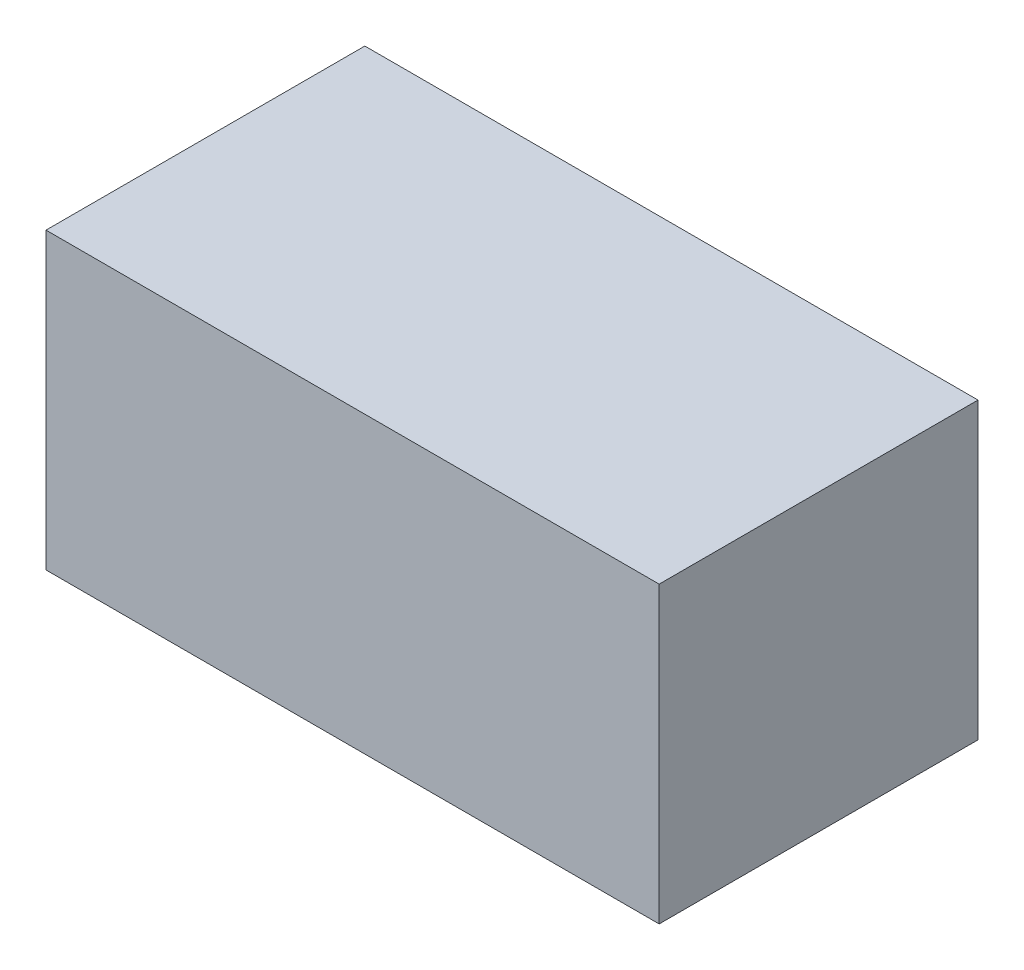
ISO-10303-21;
HEADER;
FILE_DESCRIPTION(('STEP AP214'),'2;1');
FILE_NAME('part.step','',(''),(''),'','','');
FILE_SCHEMA(('AUTOMOTIVE_DESIGN { 1 0 10303 214 1 1 1 1 }'));
ENDSEC;
DATA;
#1=APPLICATION_CONTEXT('core data for automotive mechanical design processes');
#2=APPLICATION_PROTOCOL_DEFINITION('international standard','automotive_design',2000,#1);
#3=PRODUCT_CONTEXT('',#1,'mechanical');
#4=PRODUCT('Part','Part','',(#3));
#5=PRODUCT_RELATED_PRODUCT_CATEGORY('part','',(#4));
#6=PRODUCT_DEFINITION_FORMATION('','',#4);
#7=PRODUCT_DEFINITION_CONTEXT('part definition',#1,'design');
#8=PRODUCT_DEFINITION('design','',#6,#7);
#9=PRODUCT_DEFINITION_SHAPE('','',#8);
#10=(LENGTH_UNIT() NAMED_UNIT(*) SI_UNIT(.MILLI.,.METRE.));
#11=(NAMED_UNIT(*) PLANE_ANGLE_UNIT() SI_UNIT($,.RADIAN.));
#12=(NAMED_UNIT(*) SI_UNIT($,.STERADIAN.) SOLID_ANGLE_UNIT());
#13=UNCERTAINTY_MEASURE_WITH_UNIT(LENGTH_MEASURE(1.E-05),#10,'distance_accuracy_value','');
#14=(GEOMETRIC_REPRESENTATION_CONTEXT(3) GLOBAL_UNCERTAINTY_ASSIGNED_CONTEXT((#13)) GLOBAL_UNIT_ASSIGNED_CONTEXT((#10,
#11,#12)) REPRESENTATION_CONTEXT('',''));
#15=CARTESIAN_POINT('',(0.,0.,0.));
#16=DIRECTION('',(0.,0.,1.));
#17=DIRECTION('',(1.,0.,0.));
#18=AXIS2_PLACEMENT_3D('',#15,#16,#17);
#19=CARTESIAN_POINT('',(62.5,60.,32.5));
#20=DIRECTION('',(-1.,0.,0.));
#21=DIRECTION('',(0.,0.,1.));
#22=AXIS2_PLACEMENT_3D('',#19,#20,#21);
#23=PLANE('',#22);
#24=DIRECTION('',(0.,0.,-1.));
#25=VECTOR('',#24,1.);
#26=CARTESIAN_POINT('',(62.5,0.,32.5));
#27=LINE('',#26,#25);
#28=CARTESIAN_POINT('',(62.5,0.,32.5));
#29=VERTEX_POINT('',#28);
#30=CARTESIAN_POINT('',(62.5,0.,-32.5));
#31=VERTEX_POINT('',#30);
#32=EDGE_CURVE('E107',#29,#31,#27,.T.);
#33=ORIENTED_EDGE('',*,*,#32,.T.);
#34=DIRECTION('',(0.,-1.,0.));
#35=VECTOR('',#34,1.);
#36=CARTESIAN_POINT('',(62.5,60.,-32.5));
#37=LINE('',#36,#35);
#38=CARTESIAN_POINT('',(62.5,60.,-32.5));
#39=VERTEX_POINT('',#38);
#40=EDGE_CURVE('E11',#39,#31,#37,.T.);
#41=ORIENTED_EDGE('',*,*,#40,.F.);
#42=DIRECTION('',(0.,0.,-1.));
#43=VECTOR('',#42,1.);
#44=CARTESIAN_POINT('',(62.5,60.,32.5));
#45=LINE('',#44,#43);
#46=CARTESIAN_POINT('',(62.5,60.,32.5));
#47=VERTEX_POINT('',#46);
#48=EDGE_CURVE('E91',#47,#39,#45,.T.);
#49=ORIENTED_EDGE('',*,*,#48,.F.);
#50=DIRECTION('',(0.,-1.,0.));
#51=VECTOR('',#50,1.);
#52=CARTESIAN_POINT('',(62.5,60.,32.5));
#53=LINE('',#52,#51);
#54=EDGE_CURVE('E103',#47,#29,#53,.T.);
#55=ORIENTED_EDGE('',*,*,#54,.T.);
#56=EDGE_LOOP('',(#33,#41,#49,#55));
#57=FACE_BOUND('',#56,.T.);
#58=ADVANCED_FACE('F39',(#57),#23,.F.);
#59=CARTESIAN_POINT('',(-62.5,60.,-32.5));
#60=DIRECTION('',(0.,0.,1.));
#61=DIRECTION('',(1.,0.,0.));
#62=AXIS2_PLACEMENT_3D('',#59,#60,#61);
#63=PLANE('',#62);
#64=DIRECTION('',(-1.,0.,0.));
#65=VECTOR('',#64,1.);
#66=CARTESIAN_POINT('',(-62.5,0.,-32.5));
#67=LINE('',#66,#65);
#68=CARTESIAN_POINT('',(-62.5,0.,-32.5));
#69=VERTEX_POINT('',#68);
#70=EDGE_CURVE('E96',#31,#69,#67,.T.);
#71=ORIENTED_EDGE('',*,*,#70,.T.);
#72=DIRECTION('',(0.,-1.,0.));
#73=VECTOR('',#72,1.);
#74=CARTESIAN_POINT('',(-62.5,60.,-32.5));
#75=LINE('',#74,#73);
#76=CARTESIAN_POINT('',(-62.5,60.,-32.5));
#77=VERTEX_POINT('',#76);
#78=EDGE_CURVE('E48',#77,#69,#75,.T.);
#79=ORIENTED_EDGE('',*,*,#78,.F.);
#80=DIRECTION('',(-1.,0.,0.));
#81=VECTOR('',#80,1.);
#82=CARTESIAN_POINT('',(-62.5,60.,-32.5));
#83=LINE('',#82,#81);
#84=EDGE_CURVE('E86',#39,#77,#83,.T.);
#85=ORIENTED_EDGE('',*,*,#84,.F.);
#86=ORIENTED_EDGE('',*,*,#40,.T.);
#87=EDGE_LOOP('',(#71,#79,#85,#86));
#88=FACE_BOUND('',#87,.T.);
#89=ADVANCED_FACE('F95',(#88),#63,.F.);
#90=CARTESIAN_POINT('',(-62.5,60.,32.5));
#91=DIRECTION('',(1.,0.,0.));
#92=DIRECTION('',(0.,0.,-1.));
#93=AXIS2_PLACEMENT_3D('',#90,#91,#92);
#94=PLANE('',#93);
#95=DIRECTION('',(0.,0.,1.));
#96=VECTOR('',#95,1.);
#97=CARTESIAN_POINT('',(-62.5,0.,32.5));
#98=LINE('',#97,#96);
#99=CARTESIAN_POINT('',(-62.5,0.,32.5));
#100=VERTEX_POINT('',#99);
#101=EDGE_CURVE('E73',#69,#100,#98,.T.);
#102=ORIENTED_EDGE('',*,*,#101,.T.);
#103=DIRECTION('',(0.,-1.,0.));
#104=VECTOR('',#103,1.);
#105=CARTESIAN_POINT('',(-62.5,60.,32.5));
#106=LINE('',#105,#104);
#107=CARTESIAN_POINT('',(-62.5,60.,32.5));
#108=VERTEX_POINT('',#107);
#109=EDGE_CURVE('E98',#108,#100,#106,.T.);
#110=ORIENTED_EDGE('',*,*,#109,.F.);
#111=DIRECTION('',(0.,0.,1.));
#112=VECTOR('',#111,1.);
#113=CARTESIAN_POINT('',(-62.5,60.,32.5));
#114=LINE('',#113,#112);
#115=EDGE_CURVE('E89',#77,#108,#114,.T.);
#116=ORIENTED_EDGE('',*,*,#115,.F.);
#117=ORIENTED_EDGE('',*,*,#78,.T.);
#118=EDGE_LOOP('',(#102,#110,#116,#117));
#119=FACE_BOUND('',#118,.T.);
#120=ADVANCED_FACE('F99',(#119),#94,.F.);
#121=CARTESIAN_POINT('',(-62.5,60.,32.5));
#122=DIRECTION('',(0.,0.,-1.));
#123=DIRECTION('',(-1.,0.,0.));
#124=AXIS2_PLACEMENT_3D('',#121,#122,#123);
#125=PLANE('',#124);
#126=DIRECTION('',(1.,0.,0.));
#127=VECTOR('',#126,1.);
#128=CARTESIAN_POINT('',(-62.5,0.,32.5));
#129=LINE('',#128,#127);
#130=EDGE_CURVE('E79',#100,#29,#129,.T.);
#131=ORIENTED_EDGE('',*,*,#130,.T.);
#132=ORIENTED_EDGE('',*,*,#54,.F.);
#133=DIRECTION('',(1.,0.,0.));
#134=VECTOR('',#133,1.);
#135=CARTESIAN_POINT('',(-62.5,60.,32.5));
#136=LINE('',#135,#134);
#137=EDGE_CURVE('E56',#108,#47,#136,.T.);
#138=ORIENTED_EDGE('',*,*,#137,.F.);
#139=ORIENTED_EDGE('',*,*,#109,.T.);
#140=EDGE_LOOP('',(#131,#132,#138,#139));
#141=FACE_BOUND('',#140,.T.);
#142=ADVANCED_FACE('F120',(#141),#125,.F.);
#143=CARTESIAN_POINT('',(0.,60.,0.));
#144=DIRECTION('',(0.,-1.,0.));
#145=DIRECTION('',(0.,0.,-1.));
#146=AXIS2_PLACEMENT_3D('',#143,#144,#145);
#147=PLANE('',#146);
#148=ORIENTED_EDGE('',*,*,#48,.T.);
#149=ORIENTED_EDGE('',*,*,#84,.T.);
#150=ORIENTED_EDGE('',*,*,#115,.T.);
#151=ORIENTED_EDGE('',*,*,#137,.T.);
#152=EDGE_LOOP('',(#148,#149,#150,#151));
#153=FACE_BOUND('',#152,.T.);
#154=ADVANCED_FACE('F87',(#153),#147,.F.);
#155=CARTESIAN_POINT('',(0.,0.,0.));
#156=DIRECTION('',(0.,-1.,0.));
#157=DIRECTION('',(0.,0.,-1.));
#158=AXIS2_PLACEMENT_3D('',#155,#156,#157);
#159=PLANE('',#158);
#160=ORIENTED_EDGE('',*,*,#32,.F.);
#161=ORIENTED_EDGE('',*,*,#130,.F.);
#162=ORIENTED_EDGE('',*,*,#101,.F.);
#163=ORIENTED_EDGE('',*,*,#70,.F.);
#164=EDGE_LOOP('',(#160,#161,#162,#163));
#165=FACE_BOUND('',#164,.T.);
#166=ADVANCED_FACE('F123',(#165),#159,.T.);
#167=CLOSED_SHELL('',(#58,#89,#120,#142,#154,#166));
#168=MANIFOLD_SOLID_BREP('B2',#167);
#169=ADVANCED_BREP_SHAPE_REPRESENTATION('',(#18,#168),#14);
#170=SHAPE_DEFINITION_REPRESENTATION(#9,#169);
ENDSEC;
END-ISO-10303-21;
